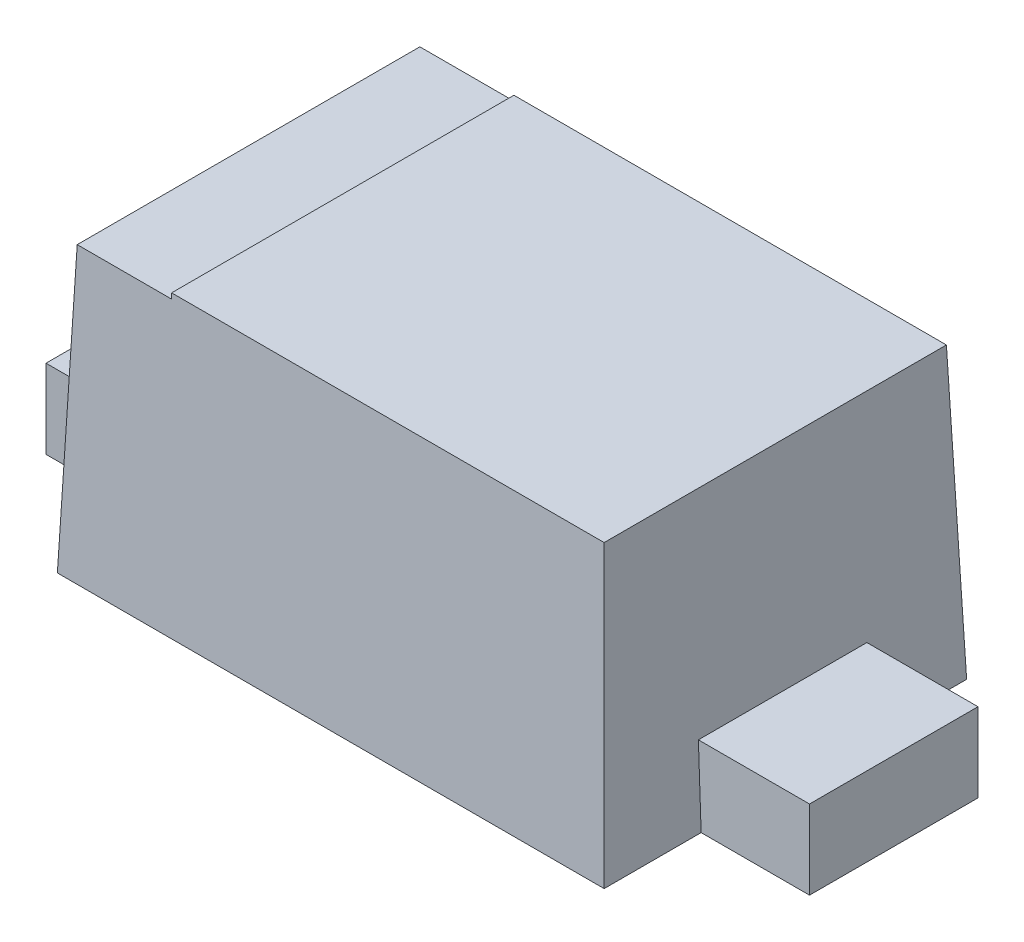
ISO-10303-21;
HEADER;
FILE_DESCRIPTION(('STEP AP214'),'2;1');
FILE_NAME('part.step','',(''),(''),'','','');
FILE_SCHEMA(('AUTOMOTIVE_DESIGN { 1 0 10303 214 1 1 1 1 }'));
ENDSEC;
DATA;
#1=APPLICATION_CONTEXT('core data for automotive mechanical design processes');
#2=APPLICATION_PROTOCOL_DEFINITION('international standard','automotive_design',2000,#1);
#3=PRODUCT_CONTEXT('',#1,'mechanical');
#4=PRODUCT('Part','Part','',(#3));
#5=PRODUCT_RELATED_PRODUCT_CATEGORY('part','',(#4));
#6=PRODUCT_DEFINITION_FORMATION('','',#4);
#7=PRODUCT_DEFINITION_CONTEXT('part definition',#1,'design');
#8=PRODUCT_DEFINITION('design','',#6,#7);
#9=PRODUCT_DEFINITION_SHAPE('','',#8);
#10=(LENGTH_UNIT() NAMED_UNIT(*) SI_UNIT(.MILLI.,.METRE.));
#11=(NAMED_UNIT(*) PLANE_ANGLE_UNIT() SI_UNIT($,.RADIAN.));
#12=(NAMED_UNIT(*) SI_UNIT($,.STERADIAN.) SOLID_ANGLE_UNIT());
#13=UNCERTAINTY_MEASURE_WITH_UNIT(LENGTH_MEASURE(1.E-05),#10,'distance_accuracy_value','');
#14=(GEOMETRIC_REPRESENTATION_CONTEXT(3) GLOBAL_UNCERTAINTY_ASSIGNED_CONTEXT((#13)) GLOBAL_UNIT_ASSIGNED_CONTEXT((#10,
#11,#12)) REPRESENTATION_CONTEXT('',''));
#15=CARTESIAN_POINT('',(0.,0.,0.));
#16=DIRECTION('',(0.,0.,1.));
#17=DIRECTION('',(1.,0.,0.));
#18=AXIS2_PLACEMENT_3D('',#15,#16,#17);
#19=CARTESIAN_POINT('',(-0.725,0.15,0.16));
#20=DIRECTION('',(0.,1.,0.));
#21=DIRECTION('',(0.,0.,1.));
#22=AXIS2_PLACEMENT_3D('',#19,#20,#21);
#23=PLANE('',#22);
#24=DIRECTION('',(0.,0.,-1.));
#25=VECTOR('',#24,1.);
#26=CARTESIAN_POINT('',(-0.725,0.15,0.16));
#27=LINE('',#26,#25);
#28=CARTESIAN_POINT('',(-0.725,0.15,-0.16));
#29=VERTEX_POINT('',#28);
#30=CARTESIAN_POINT('',(-0.725,0.15,0.16));
#31=VERTEX_POINT('',#30);
#32=EDGE_CURVE('E171',#29,#31,#27,.F.);
#33=ORIENTED_EDGE('',*,*,#32,.T.);
#34=DIRECTION('',(1.,0.,0.));
#35=VECTOR('',#34,1.);
#36=CARTESIAN_POINT('',(-0.725,0.15,0.16));
#37=LINE('',#36,#35);
#38=CARTESIAN_POINT('',(-0.513968307796699,0.15,0.16));
#39=VERTEX_POINT('',#38);
#40=EDGE_CURVE('E169',#39,#31,#37,.F.);
#41=ORIENTED_EDGE('',*,*,#40,.F.);
#42=DIRECTION('',(0.,0.,1.));
#43=VECTOR('',#42,1.);
#44=CARTESIAN_POINT('',(-0.513968307796699,0.15,-0.325));
#45=LINE('',#44,#43);
#46=CARTESIAN_POINT('',(-0.513968307796699,0.15,-0.16));
#47=VERTEX_POINT('',#46);
#48=EDGE_CURVE('E159',#47,#39,#45,.T.);
#49=ORIENTED_EDGE('',*,*,#48,.F.);
#50=DIRECTION('',(1.,0.,0.));
#51=VECTOR('',#50,1.);
#52=CARTESIAN_POINT('',(-0.725,0.15,-0.16));
#53=LINE('',#52,#51);
#54=EDGE_CURVE('E136',#29,#47,#53,.T.);
#55=ORIENTED_EDGE('',*,*,#54,.F.);
#56=EDGE_LOOP('',(#33,#41,#49,#55));
#57=FACE_BOUND('',#56,.T.);
#58=ADVANCED_FACE('F16',(#57),#23,.T.);
#59=CARTESIAN_POINT('',(-0.321399942944112,0.54,-0.587781906801865));
#60=DIRECTION('',(1.,0.,0.));
#61=DIRECTION('',(0.,0.,-1.));
#62=AXIS2_PLACEMENT_3D('',#59,#60,#61);
#63=PLANE('',#62);
#64=DIRECTION('',(0.,0.999390827019096,0.0348994967025011));
#65=VECTOR('',#64,1.);
#66=CARTESIAN_POINT('',(-0.321399942944112,0.55,-0.325));
#67=LINE('',#66,#65);
#68=CARTESIAN_POINT('',(-0.321399942944112,0.54,-0.325349207694918));
#69=VERTEX_POINT('',#68);
#70=CARTESIAN_POINT('',(-0.321399942944112,0.55,-0.325));
#71=VERTEX_POINT('',#70);
#72=EDGE_CURVE('E113',#69,#71,#67,.T.);
#73=ORIENTED_EDGE('',*,*,#72,.F.);
#74=DIRECTION('',(0.,0.,1.));
#75=VECTOR('',#74,1.);
#76=CARTESIAN_POINT('',(-0.321399942944112,0.54,0.546062578280271));
#77=LINE('',#76,#75);
#78=CARTESIAN_POINT('',(-0.321399942944112,0.54,0.325349207694917));
#79=VERTEX_POINT('',#78);
#80=EDGE_CURVE('E19',#79,#69,#77,.F.);
#81=ORIENTED_EDGE('',*,*,#80,.F.);
#82=DIRECTION('',(0.,-0.999390827019096,0.0348994967025011));
#83=VECTOR('',#82,1.);
#84=CARTESIAN_POINT('',(-0.321399942944112,0.55,0.325));
#85=LINE('',#84,#83);
#86=CARTESIAN_POINT('',(-0.321399942944112,0.55,0.325));
#87=VERTEX_POINT('',#86);
#88=EDGE_CURVE('E149',#87,#79,#85,.T.);
#89=ORIENTED_EDGE('',*,*,#88,.F.);
#90=DIRECTION('',(0.,0.,1.));
#91=VECTOR('',#90,1.);
#92=CARTESIAN_POINT('',(-0.321399942944112,0.55,0.325));
#93=LINE('',#92,#91);
#94=EDGE_CURVE('E127',#71,#87,#93,.T.);
#95=ORIENTED_EDGE('',*,*,#94,.F.);
#96=EDGE_LOOP('',(#73,#81,#89,#95));
#97=FACE_BOUND('',#96,.T.);
#98=ADVANCED_FACE('F132',(#97),#63,.F.);
#99=CARTESIAN_POINT('',(-0.609409420995632,0.54,0.546062578280271));
#100=DIRECTION('',(0.,1.,0.));
#101=DIRECTION('',(0.,0.,1.));
#102=AXIS2_PLACEMENT_3D('',#99,#100,#101);
#103=PLANE('',#102);
#104=DIRECTION('',(1.,0.,0.));
#105=VECTOR('',#104,1.);
#106=CARTESIAN_POINT('',(-0.5,0.54,-0.325349207694918));
#107=LINE('',#106,#105);
#108=CARTESIAN_POINT('',(-0.500349207694918,0.54,-0.325349207694918));
#109=VERTEX_POINT('',#108);
#110=EDGE_CURVE('E122',#109,#69,#107,.T.);
#111=ORIENTED_EDGE('',*,*,#110,.F.);
#112=DIRECTION('',(0.,0.,1.));
#113=VECTOR('',#112,1.);
#114=CARTESIAN_POINT('',(-0.500349207694917,0.54,-0.325));
#115=LINE('',#114,#113);
#116=CARTESIAN_POINT('',(-0.500349207694918,0.54,0.325349207694917));
#117=VERTEX_POINT('',#116);
#118=EDGE_CURVE('E165',#117,#109,#115,.F.);
#119=ORIENTED_EDGE('',*,*,#118,.F.);
#120=DIRECTION('',(1.,0.,0.));
#121=VECTOR('',#120,1.);
#122=CARTESIAN_POINT('',(-0.5,0.54,0.325349207694918));
#123=LINE('',#122,#121);
#124=EDGE_CURVE('E124',#79,#117,#123,.F.);
#125=ORIENTED_EDGE('',*,*,#124,.F.);
#126=ORIENTED_EDGE('',*,*,#80,.T.);
#127=EDGE_LOOP('',(#111,#119,#125,#126));
#128=FACE_BOUND('',#127,.T.);
#129=ADVANCED_FACE('F120',(#128),#103,.T.);
#130=CARTESIAN_POINT('',(-0.725,0.15,0.16));
#131=DIRECTION('',(0.,1.,0.));
#132=DIRECTION('',(0.,0.,1.));
#133=AXIS2_PLACEMENT_3D('',#130,#131,#132);
#134=PLANE('',#133);
#135=DIRECTION('',(0.,0.,-1.));
#136=VECTOR('',#135,1.);
#137=CARTESIAN_POINT('',(0.725,0.15,0.16));
#138=LINE('',#137,#136);
#139=CARTESIAN_POINT('',(0.725,0.15,-0.16));
#140=VERTEX_POINT('',#139);
#141=CARTESIAN_POINT('',(0.725,0.15,0.16));
#142=VERTEX_POINT('',#141);
#143=EDGE_CURVE('E237',#140,#142,#138,.F.);
#144=ORIENTED_EDGE('',*,*,#143,.F.);
#145=DIRECTION('',(1.,0.,0.));
#146=VECTOR('',#145,1.);
#147=CARTESIAN_POINT('',(-0.725,0.15,-0.16));
#148=LINE('',#147,#146);
#149=CARTESIAN_POINT('',(0.513968307796699,0.15,-0.16));
#150=VERTEX_POINT('',#149);
#151=EDGE_CURVE('E235',#150,#140,#148,.T.);
#152=ORIENTED_EDGE('',*,*,#151,.F.);
#153=DIRECTION('',(0.,0.,1.));
#154=VECTOR('',#153,1.);
#155=CARTESIAN_POINT('',(0.513968307796699,0.15,-0.325));
#156=LINE('',#155,#154);
#157=CARTESIAN_POINT('',(0.513968307796699,0.15,0.16));
#158=VERTEX_POINT('',#157);
#159=EDGE_CURVE('E228',#158,#150,#156,.F.);
#160=ORIENTED_EDGE('',*,*,#159,.F.);
#161=DIRECTION('',(1.,0.,0.));
#162=VECTOR('',#161,1.);
#163=CARTESIAN_POINT('',(-0.725,0.15,0.16));
#164=LINE('',#163,#162);
#165=EDGE_CURVE('E242',#142,#158,#164,.F.);
#166=ORIENTED_EDGE('',*,*,#165,.F.);
#167=EDGE_LOOP('',(#144,#152,#160,#166));
#168=FACE_BOUND('',#167,.T.);
#169=ADVANCED_FACE('F265',(#168),#134,.T.);
#170=CARTESIAN_POINT('',(-0.5,0.55,0.325));
#171=DIRECTION('',(0.,1.,0.));
#172=DIRECTION('',(0.,0.,1.));
#173=AXIS2_PLACEMENT_3D('',#170,#171,#172);
#174=PLANE('',#173);
#175=DIRECTION('',(0.,0.,1.));
#176=VECTOR('',#175,1.);
#177=CARTESIAN_POINT('',(0.5,0.55,-0.325));
#178=LINE('',#177,#176);
#179=CARTESIAN_POINT('',(0.5,0.55,-0.325));
#180=VERTEX_POINT('',#179);
#181=CARTESIAN_POINT('',(0.5,0.55,0.325));
#182=VERTEX_POINT('',#181);
#183=EDGE_CURVE('E222',#180,#182,#178,.T.);
#184=ORIENTED_EDGE('',*,*,#183,.F.);
#185=DIRECTION('',(1.,0.,0.));
#186=VECTOR('',#185,1.);
#187=CARTESIAN_POINT('',(-0.5,0.55,-0.325));
#188=LINE('',#187,#186);
#189=EDGE_CURVE('E134',#71,#180,#188,.T.);
#190=ORIENTED_EDGE('',*,*,#189,.F.);
#191=ORIENTED_EDGE('',*,*,#94,.T.);
#192=DIRECTION('',(1.,0.,0.));
#193=VECTOR('',#192,1.);
#194=CARTESIAN_POINT('',(-0.5,0.55,0.325));
#195=LINE('',#194,#193);
#196=EDGE_CURVE('E144',#182,#87,#195,.F.);
#197=ORIENTED_EDGE('',*,*,#196,.F.);
#198=EDGE_LOOP('',(#184,#190,#191,#197));
#199=FACE_BOUND('',#198,.T.);
#200=ADVANCED_FACE('F143',(#199),#174,.T.);
#201=CARTESIAN_POINT('',(-0.5,0.55,-0.325));
#202=DIRECTION('',(0.,0.0348994967025011,-0.999390827019096));
#203=DIRECTION('',(0.,0.999390827019096,0.0348994967025011));
#204=AXIS2_PLACEMENT_3D('',#201,#202,#203);
#205=PLANE('',#204);
#206=DIRECTION('',(1.,0.,0.));
#207=VECTOR('',#206,1.);
#208=CARTESIAN_POINT('',(-0.5,0.,-0.344206423220461));
#209=LINE('',#208,#207);
#210=CARTESIAN_POINT('',(0.519206423220461,0.,-0.344206423220461));
#211=VERTEX_POINT('',#210);
#212=CARTESIAN_POINT('',(-0.519206423220461,0.,-0.344206423220461));
#213=VERTEX_POINT('',#212);
#214=EDGE_CURVE('E219',#211,#213,#209,.F.);
#215=ORIENTED_EDGE('',*,*,#214,.T.);
#216=DIRECTION('',(-0.0348782627423748,-0.998782765958718,-0.0348782627423751));
#217=VECTOR('',#216,1.);
#218=CARTESIAN_POINT('',(-0.500349207694917,0.54,-0.325349207694917));
#219=LINE('',#218,#217);
#220=EDGE_CURVE('E130',#109,#213,#219,.T.);
#221=ORIENTED_EDGE('',*,*,#220,.F.);
#222=ORIENTED_EDGE('',*,*,#110,.T.);
#223=ORIENTED_EDGE('',*,*,#72,.T.);
#224=ORIENTED_EDGE('',*,*,#189,.T.);
#225=DIRECTION('',(-0.0348782627423747,0.998782765958718,0.0348782627423741));
#226=VECTOR('',#225,1.);
#227=CARTESIAN_POINT('',(0.519206423220461,0.,-0.344206423220461));
#228=LINE('',#227,#226);
#229=EDGE_CURVE('E224',#211,#180,#228,.T.);
#230=ORIENTED_EDGE('',*,*,#229,.F.);
#231=EDGE_LOOP('',(#215,#221,#222,#223,#224,#230));
#232=FACE_BOUND('',#231,.T.);
#233=ADVANCED_FACE('F129',(#232),#205,.T.);
#234=CARTESIAN_POINT('',(-0.725,0.15,-0.16));
#235=DIRECTION('',(0.,0.,-1.));
#236=DIRECTION('',(0.,1.,0.));
#237=AXIS2_PLACEMENT_3D('',#234,#235,#236);
#238=PLANE('',#237);
#239=DIRECTION('',(0.,1.,0.));
#240=VECTOR('',#239,1.);
#241=CARTESIAN_POINT('',(-0.725,0.,-0.16));
#242=LINE('',#241,#240);
#243=CARTESIAN_POINT('',(-0.725,0.,-0.16));
#244=VERTEX_POINT('',#243);
#245=EDGE_CURVE('E174',#244,#29,#242,.T.);
#246=ORIENTED_EDGE('',*,*,#245,.T.);
#247=ORIENTED_EDGE('',*,*,#54,.T.);
#248=DIRECTION('',(-0.0348994967025011,-0.999390827019096,0.));
#249=VECTOR('',#248,1.);
#250=CARTESIAN_POINT('',(-0.5,0.55,-0.16));
#251=LINE('',#250,#249);
#252=CARTESIAN_POINT('',(-0.519206423220461,0.,-0.16));
#253=VERTEX_POINT('',#252);
#254=EDGE_CURVE('E161',#253,#47,#251,.F.);
#255=ORIENTED_EDGE('',*,*,#254,.F.);
#256=DIRECTION('',(1.,0.,0.));
#257=VECTOR('',#256,1.);
#258=CARTESIAN_POINT('',(-0.5,0.,-0.16));
#259=LINE('',#258,#257);
#260=EDGE_CURVE('E216',#253,#244,#259,.F.);
#261=ORIENTED_EDGE('',*,*,#260,.T.);
#262=EDGE_LOOP('',(#246,#247,#255,#261));
#263=FACE_BOUND('',#262,.T.);
#264=ADVANCED_FACE('F177',(#263),#238,.T.);
#265=CARTESIAN_POINT('',(-0.725,0.,0.16));
#266=DIRECTION('',(1.,0.,0.));
#267=DIRECTION('',(0.,0.,-1.));
#268=AXIS2_PLACEMENT_3D('',#265,#266,#267);
#269=PLANE('',#268);
#270=ORIENTED_EDGE('',*,*,#32,.F.);
#271=ORIENTED_EDGE('',*,*,#245,.F.);
#272=DIRECTION('',(0.,0.,1.));
#273=VECTOR('',#272,1.);
#274=CARTESIAN_POINT('',(-0.725,0.,0.325));
#275=LINE('',#274,#273);
#276=CARTESIAN_POINT('',(-0.725,0.,0.16));
#277=VERTEX_POINT('',#276);
#278=EDGE_CURVE('E211',#244,#277,#275,.T.);
#279=ORIENTED_EDGE('',*,*,#278,.T.);
#280=DIRECTION('',(0.,-1.,0.));
#281=VECTOR('',#280,1.);
#282=CARTESIAN_POINT('',(-0.725,0.15,0.16));
#283=LINE('',#282,#281);
#284=EDGE_CURVE('E167',#31,#277,#283,.T.);
#285=ORIENTED_EDGE('',*,*,#284,.F.);
#286=EDGE_LOOP('',(#270,#271,#279,#285));
#287=FACE_BOUND('',#286,.T.);
#288=ADVANCED_FACE('F330',(#287),#269,.F.);
#289=CARTESIAN_POINT('',(-0.725,0.15,0.16));
#290=DIRECTION('',(0.,0.,1.));
#291=DIRECTION('',(0.,-1.,0.));
#292=AXIS2_PLACEMENT_3D('',#289,#290,#291);
#293=PLANE('',#292);
#294=ORIENTED_EDGE('',*,*,#284,.T.);
#295=DIRECTION('',(1.,0.,0.));
#296=VECTOR('',#295,1.);
#297=CARTESIAN_POINT('',(-0.5,0.,0.16));
#298=LINE('',#297,#296);
#299=CARTESIAN_POINT('',(-0.519206423220461,0.,0.16));
#300=VERTEX_POINT('',#299);
#301=EDGE_CURVE('E196',#277,#300,#298,.T.);
#302=ORIENTED_EDGE('',*,*,#301,.T.);
#303=DIRECTION('',(-0.0348994967025011,-0.999390827019096,0.));
#304=VECTOR('',#303,1.);
#305=CARTESIAN_POINT('',(-0.5,0.55,0.16));
#306=LINE('',#305,#304);
#307=EDGE_CURVE('E151',#39,#300,#306,.T.);
#308=ORIENTED_EDGE('',*,*,#307,.F.);
#309=ORIENTED_EDGE('',*,*,#40,.T.);
#310=EDGE_LOOP('',(#294,#302,#308,#309));
#311=FACE_BOUND('',#310,.T.);
#312=ADVANCED_FACE('F194',(#311),#293,.T.);
#313=CARTESIAN_POINT('',(-0.5,0.55,-0.325));
#314=DIRECTION('',(-0.999390827019096,0.0348994967025011,0.));
#315=DIRECTION('',(-0.0348994967025011,-0.999390827019096,0.));
#316=AXIS2_PLACEMENT_3D('',#313,#314,#315);
#317=PLANE('',#316);
#318=DIRECTION('',(0.,0.,1.));
#319=VECTOR('',#318,1.);
#320=CARTESIAN_POINT('',(-0.519206423220461,0.,0.325));
#321=LINE('',#320,#319);
#322=CARTESIAN_POINT('',(-0.519206423220461,0.,0.344206423220461));
#323=VERTEX_POINT('',#322);
#324=EDGE_CURVE('E199',#300,#323,#321,.T.);
#325=ORIENTED_EDGE('',*,*,#324,.T.);
#326=DIRECTION('',(-0.0348782627423732,-0.998782765958718,0.0348782627423747));
#327=VECTOR('',#326,1.);
#328=CARTESIAN_POINT('',(-0.500349207694918,0.54,0.325349207694918));
#329=LINE('',#328,#327);
#330=EDGE_CURVE('E154',#117,#323,#329,.T.);
#331=ORIENTED_EDGE('',*,*,#330,.F.);
#332=ORIENTED_EDGE('',*,*,#118,.T.);
#333=ORIENTED_EDGE('',*,*,#220,.T.);
#334=DIRECTION('',(0.,0.,1.));
#335=VECTOR('',#334,1.);
#336=CARTESIAN_POINT('',(-0.519206423220461,0.,0.325));
#337=LINE('',#336,#335);
#338=EDGE_CURVE('E189',#213,#253,#337,.T.);
#339=ORIENTED_EDGE('',*,*,#338,.T.);
#340=ORIENTED_EDGE('',*,*,#254,.T.);
#341=ORIENTED_EDGE('',*,*,#48,.T.);
#342=ORIENTED_EDGE('',*,*,#307,.T.);
#343=EDGE_LOOP('',(#325,#331,#332,#333,#339,#340,#341,#342));
#344=FACE_BOUND('',#343,.T.);
#345=ADVANCED_FACE('F186',(#344),#317,.T.);
#346=CARTESIAN_POINT('',(-0.5,0.55,0.325));
#347=DIRECTION('',(0.,0.0348994967025011,0.999390827019096));
#348=DIRECTION('',(0.,-0.999390827019096,0.0348994967025011));
#349=AXIS2_PLACEMENT_3D('',#346,#347,#348);
#350=PLANE('',#349);
#351=DIRECTION('',(1.,0.,0.));
#352=VECTOR('',#351,1.);
#353=CARTESIAN_POINT('',(-0.5,0.,0.344206423220461));
#354=LINE('',#353,#352);
#355=CARTESIAN_POINT('',(0.519206423220461,0.,0.344206423220461));
#356=VERTEX_POINT('',#355);
#357=EDGE_CURVE('E207',#323,#356,#354,.T.);
#358=ORIENTED_EDGE('',*,*,#357,.T.);
#359=DIRECTION('',(0.0348782627423747,-0.998782765958718,0.0348782627423741));
#360=VECTOR('',#359,1.);
#361=CARTESIAN_POINT('',(0.5,0.55,0.325));
#362=LINE('',#361,#360);
#363=EDGE_CURVE('E150',#182,#356,#362,.T.);
#364=ORIENTED_EDGE('',*,*,#363,.F.);
#365=ORIENTED_EDGE('',*,*,#196,.T.);
#366=ORIENTED_EDGE('',*,*,#88,.T.);
#367=ORIENTED_EDGE('',*,*,#124,.T.);
#368=ORIENTED_EDGE('',*,*,#330,.T.);
#369=EDGE_LOOP('',(#358,#364,#365,#366,#367,#368));
#370=FACE_BOUND('',#369,.T.);
#371=ADVANCED_FACE('F148',(#370),#350,.T.);
#372=CARTESIAN_POINT('',(-0.725,0.15,0.16));
#373=DIRECTION('',(0.,0.,1.));
#374=DIRECTION('',(0.,-1.,0.));
#375=AXIS2_PLACEMENT_3D('',#372,#373,#374);
#376=PLANE('',#375);
#377=DIRECTION('',(0.,1.,0.));
#378=VECTOR('',#377,1.);
#379=CARTESIAN_POINT('',(0.725,0.,0.16));
#380=LINE('',#379,#378);
#381=CARTESIAN_POINT('',(0.725,0.,0.16));
#382=VERTEX_POINT('',#381);
#383=EDGE_CURVE('E240',#142,#382,#380,.F.);
#384=ORIENTED_EDGE('',*,*,#383,.F.);
#385=ORIENTED_EDGE('',*,*,#165,.T.);
#386=DIRECTION('',(-0.0348994967025011,0.999390827019096,0.));
#387=VECTOR('',#386,1.);
#388=CARTESIAN_POINT('',(0.5,0.55,0.16));
#389=LINE('',#388,#387);
#390=CARTESIAN_POINT('',(0.519206423220461,0.,0.16));
#391=VERTEX_POINT('',#390);
#392=EDGE_CURVE('E230',#391,#158,#389,.T.);
#393=ORIENTED_EDGE('',*,*,#392,.F.);
#394=DIRECTION('',(1.,0.,0.));
#395=VECTOR('',#394,1.);
#396=CARTESIAN_POINT('',(-0.5,0.,0.16));
#397=LINE('',#396,#395);
#398=EDGE_CURVE('E253',#391,#382,#397,.T.);
#399=ORIENTED_EDGE('',*,*,#398,.T.);
#400=EDGE_LOOP('',(#384,#385,#393,#399));
#401=FACE_BOUND('',#400,.T.);
#402=ADVANCED_FACE('F262',(#401),#376,.T.);
#403=CARTESIAN_POINT('',(0.725,0.,0.16));
#404=DIRECTION('',(1.,0.,0.));
#405=DIRECTION('',(0.,0.,-1.));
#406=AXIS2_PLACEMENT_3D('',#403,#404,#405);
#407=PLANE('',#406);
#408=DIRECTION('',(0.,1.,0.));
#409=VECTOR('',#408,1.);
#410=CARTESIAN_POINT('',(0.725,0.15,-0.16));
#411=LINE('',#410,#409);
#412=CARTESIAN_POINT('',(0.725,0.,-0.16));
#413=VERTEX_POINT('',#412);
#414=EDGE_CURVE('E233',#140,#413,#411,.F.);
#415=ORIENTED_EDGE('',*,*,#414,.F.);
#416=ORIENTED_EDGE('',*,*,#143,.T.);
#417=ORIENTED_EDGE('',*,*,#383,.T.);
#418=DIRECTION('',(0.,0.,1.));
#419=VECTOR('',#418,1.);
#420=CARTESIAN_POINT('',(0.725,0.,0.325));
#421=LINE('',#420,#419);
#422=EDGE_CURVE('E251',#382,#413,#421,.F.);
#423=ORIENTED_EDGE('',*,*,#422,.T.);
#424=EDGE_LOOP('',(#415,#416,#417,#423));
#425=FACE_BOUND('',#424,.T.);
#426=ADVANCED_FACE('F268',(#425),#407,.T.);
#427=CARTESIAN_POINT('',(-0.725,0.15,-0.16));
#428=DIRECTION('',(0.,0.,-1.));
#429=DIRECTION('',(0.,1.,0.));
#430=AXIS2_PLACEMENT_3D('',#427,#428,#429);
#431=PLANE('',#430);
#432=ORIENTED_EDGE('',*,*,#414,.T.);
#433=DIRECTION('',(1.,0.,0.));
#434=VECTOR('',#433,1.);
#435=CARTESIAN_POINT('',(-0.5,0.,-0.16));
#436=LINE('',#435,#434);
#437=CARTESIAN_POINT('',(0.519206423220461,0.,-0.16));
#438=VERTEX_POINT('',#437);
#439=EDGE_CURVE('E25',#413,#438,#436,.F.);
#440=ORIENTED_EDGE('',*,*,#439,.T.);
#441=DIRECTION('',(-0.0348994967025011,0.999390827019096,0.));
#442=VECTOR('',#441,1.);
#443=CARTESIAN_POINT('',(0.5,0.55,-0.16));
#444=LINE('',#443,#442);
#445=EDGE_CURVE('E33',#150,#438,#444,.F.);
#446=ORIENTED_EDGE('',*,*,#445,.F.);
#447=ORIENTED_EDGE('',*,*,#151,.T.);
#448=EDGE_LOOP('',(#432,#440,#446,#447));
#449=FACE_BOUND('',#448,.T.);
#450=ADVANCED_FACE('F249',(#449),#431,.T.);
#451=CARTESIAN_POINT('',(0.5,0.55,-0.325));
#452=DIRECTION('',(0.999390827019096,0.0348994967025011,0.));
#453=DIRECTION('',(-0.0348994967025011,0.999390827019096,0.));
#454=AXIS2_PLACEMENT_3D('',#451,#452,#453);
#455=PLANE('',#454);
#456=ORIENTED_EDGE('',*,*,#183,.T.);
#457=ORIENTED_EDGE('',*,*,#363,.T.);
#458=DIRECTION('',(0.,0.,1.));
#459=VECTOR('',#458,1.);
#460=CARTESIAN_POINT('',(0.519206423220461,0.,0.325));
#461=LINE('',#460,#459);
#462=EDGE_CURVE('E209',#356,#391,#461,.F.);
#463=ORIENTED_EDGE('',*,*,#462,.T.);
#464=ORIENTED_EDGE('',*,*,#392,.T.);
#465=ORIENTED_EDGE('',*,*,#159,.T.);
#466=ORIENTED_EDGE('',*,*,#445,.T.);
#467=DIRECTION('',(0.,0.,1.));
#468=VECTOR('',#467,1.);
#469=CARTESIAN_POINT('',(0.519206423220461,0.,0.325));
#470=LINE('',#469,#468);
#471=EDGE_CURVE('E11',#438,#211,#470,.F.);
#472=ORIENTED_EDGE('',*,*,#471,.T.);
#473=ORIENTED_EDGE('',*,*,#229,.T.);
#474=EDGE_LOOP('',(#456,#457,#463,#464,#465,#466,#472,#473));
#475=FACE_BOUND('',#474,.T.);
#476=ADVANCED_FACE('F244',(#475),#455,.T.);
#477=CARTESIAN_POINT('',(-0.5,0.,0.325));
#478=DIRECTION('',(0.,1.,0.));
#479=DIRECTION('',(0.,0.,1.));
#480=AXIS2_PLACEMENT_3D('',#477,#478,#479);
#481=PLANE('',#480);
#482=ORIENTED_EDGE('',*,*,#439,.F.);
#483=ORIENTED_EDGE('',*,*,#422,.F.);
#484=ORIENTED_EDGE('',*,*,#398,.F.);
#485=ORIENTED_EDGE('',*,*,#462,.F.);
#486=ORIENTED_EDGE('',*,*,#357,.F.);
#487=ORIENTED_EDGE('',*,*,#324,.F.);
#488=ORIENTED_EDGE('',*,*,#301,.F.);
#489=ORIENTED_EDGE('',*,*,#278,.F.);
#490=ORIENTED_EDGE('',*,*,#260,.F.);
#491=ORIENTED_EDGE('',*,*,#338,.F.);
#492=ORIENTED_EDGE('',*,*,#214,.F.);
#493=ORIENTED_EDGE('',*,*,#471,.F.);
#494=EDGE_LOOP('',(#482,#483,#484,#485,#486,#487,#488,#489,#490,#491,#492,#493));
#495=FACE_BOUND('',#494,.T.);
#496=ADVANCED_FACE('F203',(#495),#481,.F.);
#497=CLOSED_SHELL('',(#58,#98,#129,#169,#200,#233,#264,#288,#312,#345,#371,#402,#426,#450,#476,#496));
#498=MANIFOLD_SOLID_BREP('B1',#497);
#499=ADVANCED_BREP_SHAPE_REPRESENTATION('',(#18,#498),#14);
#500=SHAPE_DEFINITION_REPRESENTATION(#9,#499);
ENDSEC;
END-ISO-10303-21;
